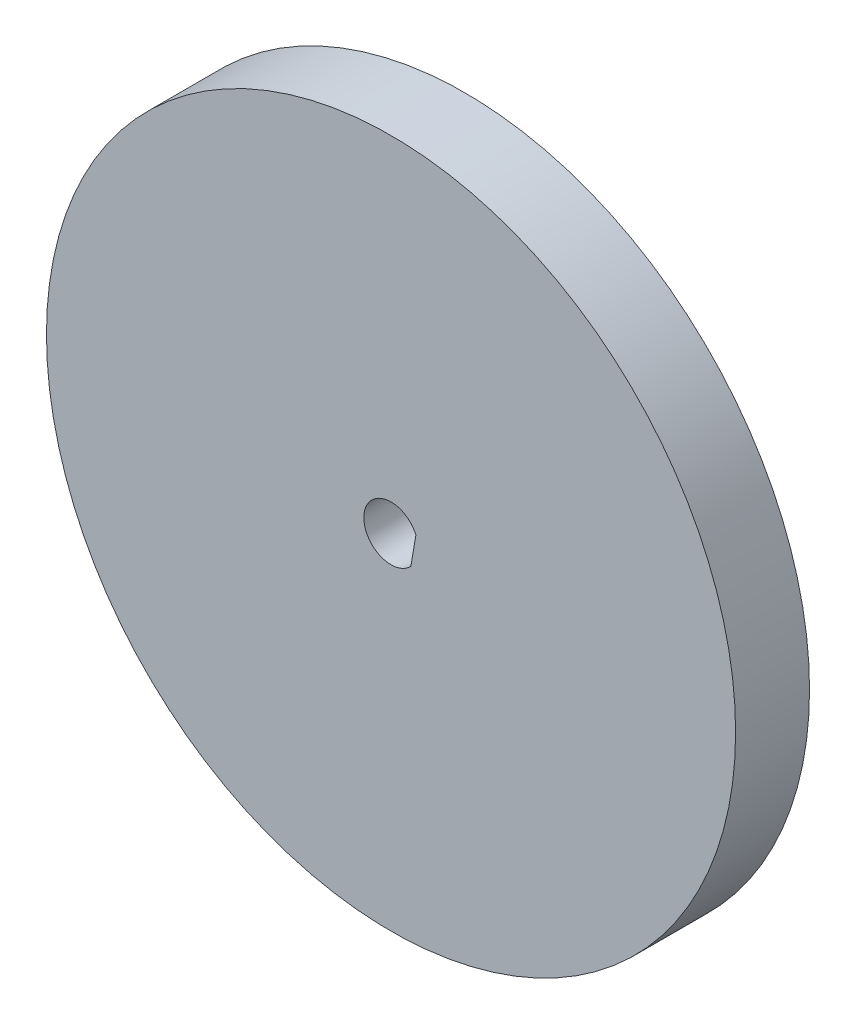
ISO-10303-21;
HEADER;
FILE_DESCRIPTION(('STEP AP214'),'2;1');
FILE_NAME('part.step','',(''),(''),'','','');
FILE_SCHEMA(('AUTOMOTIVE_DESIGN { 1 0 10303 214 1 1 1 1 }'));
ENDSEC;
DATA;
#1=APPLICATION_CONTEXT('core data for automotive mechanical design processes');
#2=APPLICATION_PROTOCOL_DEFINITION('international standard','automotive_design',2000,#1);
#3=PRODUCT_CONTEXT('',#1,'mechanical');
#4=PRODUCT('Part','Part','',(#3));
#5=PRODUCT_RELATED_PRODUCT_CATEGORY('part','',(#4));
#6=PRODUCT_DEFINITION_FORMATION('','',#4);
#7=PRODUCT_DEFINITION_CONTEXT('part definition',#1,'design');
#8=PRODUCT_DEFINITION('design','',#6,#7);
#9=PRODUCT_DEFINITION_SHAPE('','',#8);
#10=(LENGTH_UNIT() NAMED_UNIT(*) SI_UNIT(.MILLI.,.METRE.));
#11=(NAMED_UNIT(*) PLANE_ANGLE_UNIT() SI_UNIT($,.RADIAN.));
#12=(NAMED_UNIT(*) SI_UNIT($,.STERADIAN.) SOLID_ANGLE_UNIT());
#13=UNCERTAINTY_MEASURE_WITH_UNIT(LENGTH_MEASURE(1.E-05),#10,'distance_accuracy_value','');
#14=(GEOMETRIC_REPRESENTATION_CONTEXT(3) GLOBAL_UNCERTAINTY_ASSIGNED_CONTEXT((#13)) GLOBAL_UNIT_ASSIGNED_CONTEXT((#10,
#11,#12)) REPRESENTATION_CONTEXT('',''));
#15=CARTESIAN_POINT('',(0.,0.,0.));
#16=DIRECTION('',(0.,0.,1.));
#17=DIRECTION('',(1.,0.,0.));
#18=AXIS2_PLACEMENT_3D('',#15,#16,#17);
#19=CARTESIAN_POINT('',(-10.991688670515,10.7963621549345,8.1534));
#20=DIRECTION('',(0.,0.,-1.));
#21=DIRECTION('',(-1.,0.,0.));
#22=AXIS2_PLACEMENT_3D('',#19,#20,#21);
#23=CYLINDRICAL_SURFACE('',#22,38.);
#24=CARTESIAN_POINT('',(-10.991688670515,10.7963621549345,8.1534));
#25=DIRECTION('',(0.,0.,1.));
#26=DIRECTION('',(1.,0.,0.));
#27=AXIS2_PLACEMENT_3D('',#24,#25,#26);
#28=CIRCLE('',#27,38.);
#29=CARTESIAN_POINT('',(27.008311329485,10.7963621549345,8.1534));
#30=VERTEX_POINT('',#29);
#31=EDGE_CURVE('E11',#30,#30,#28,.T.);
#32=ORIENTED_EDGE('',*,*,#31,.F.);
#33=EDGE_LOOP('',(#32));
#34=FACE_BOUND('',#33,.T.);
#35=CARTESIAN_POINT('',(-10.991688670515,10.7963621549345,0.));
#36=DIRECTION('',(0.,0.,1.));
#37=DIRECTION('',(1.,0.,0.));
#38=AXIS2_PLACEMENT_3D('',#35,#36,#37);
#39=CIRCLE('',#38,38.);
#40=CARTESIAN_POINT('',(27.008311329485,10.7963621549345,0.));
#41=VERTEX_POINT('',#40);
#42=EDGE_CURVE('E36',#41,#41,#39,.T.);
#43=ORIENTED_EDGE('',*,*,#42,.T.);
#44=EDGE_LOOP('',(#43));
#45=FACE_BOUND('',#44,.T.);
#46=ADVANCED_FACE('F33',(#34,#45),#23,.T.);
#47=CARTESIAN_POINT('',(-10.991688670515,10.7963621549345,8.1534));
#48=DIRECTION('',(0.,0.,1.));
#49=DIRECTION('',(1.,0.,0.));
#50=AXIS2_PLACEMENT_3D('',#47,#48,#49);
#51=PLANE('',#50);
#52=CARTESIAN_POINT('',(-10.991688670515,10.7963621549345,8.1534));
#53=DIRECTION('',(0.,0.,1.));
#54=DIRECTION('',(1.,0.,0.));
#55=AXIS2_PLACEMENT_3D('',#52,#53,#54);
#56=CIRCLE('',#55,3.);
#57=CARTESIAN_POINT('',(-8.24930501310143,12.0126400325393,8.1534));
#58=VERTEX_POINT('',#57);
#59=CARTESIAN_POINT('',(-8.80466798129166,8.74284310099101,8.1534));
#60=VERTEX_POINT('',#59);
#61=EDGE_CURVE('E47',#58,#60,#56,.T.);
#62=ORIENTED_EDGE('',*,*,#61,.F.);
#63=DIRECTION('',(0.167448235267732,0.985880869327386,0.));
#64=VECTOR('',#63,1.);
#65=CARTESIAN_POINT('',(-8.52698649719654,10.3777415667652,8.1534));
#66=LINE('',#65,#64);
#67=EDGE_CURVE('E66',#60,#58,#66,.T.);
#68=ORIENTED_EDGE('',*,*,#67,.F.);
#69=EDGE_LOOP('',(#62,#68));
#70=FACE_BOUND('',#69,.T.);
#71=ORIENTED_EDGE('',*,*,#31,.T.);
#72=EDGE_LOOP('',(#71));
#73=FACE_BOUND('',#72,.T.);
#74=ADVANCED_FACE('F70',(#70,#73),#51,.T.);
#75=CARTESIAN_POINT('',(-10.991688670515,10.7963621549345,0.));
#76=DIRECTION('',(0.,0.,1.));
#77=DIRECTION('',(1.,0.,0.));
#78=AXIS2_PLACEMENT_3D('',#75,#76,#77);
#79=PLANE('',#78);
#80=DIRECTION('',(0.167448235267731,0.985880869327386,0.));
#81=VECTOR('',#80,1.);
#82=CARTESIAN_POINT('',(-8.80466798129165,8.74284310099101,0.));
#83=LINE('',#82,#81);
#84=CARTESIAN_POINT('',(-8.80466798129165,8.74284310099101,0.));
#85=VERTEX_POINT('',#84);
#86=CARTESIAN_POINT('',(-8.24930501310143,12.0126400325393,0.));
#87=VERTEX_POINT('',#86);
#88=EDGE_CURVE('E74',#85,#87,#83,.T.);
#89=ORIENTED_EDGE('',*,*,#88,.T.);
#90=CARTESIAN_POINT('',(-10.991688670515,10.7963621549345,0.));
#91=DIRECTION('',(0.,0.,1.));
#92=DIRECTION('',(1.,0.,0.));
#93=AXIS2_PLACEMENT_3D('',#90,#91,#92);
#94=CIRCLE('',#93,3.);
#95=EDGE_CURVE('E52',#87,#85,#94,.T.);
#96=ORIENTED_EDGE('',*,*,#95,.T.);
#97=EDGE_LOOP('',(#89,#96));
#98=FACE_BOUND('',#97,.T.);
#99=ORIENTED_EDGE('',*,*,#42,.F.);
#100=EDGE_LOOP('',(#99));
#101=FACE_BOUND('',#100,.T.);
#102=ADVANCED_FACE('F78',(#98,#101),#79,.F.);
#103=CARTESIAN_POINT('',(-10.991688670515,10.7963621549345,0.));
#104=DIRECTION('',(0.,0.,1.));
#105=DIRECTION('',(1.,0.,0.));
#106=AXIS2_PLACEMENT_3D('',#103,#104,#105);
#107=CYLINDRICAL_SURFACE('',#106,3.);
#108=ORIENTED_EDGE('',*,*,#61,.T.);
#109=DIRECTION('',(0.,0.,1.));
#110=VECTOR('',#109,1.);
#111=CARTESIAN_POINT('',(-8.80466798129165,8.74284310099101,0.));
#112=LINE('',#111,#110);
#113=EDGE_CURVE('E63',#85,#60,#112,.T.);
#114=ORIENTED_EDGE('',*,*,#113,.F.);
#115=ORIENTED_EDGE('',*,*,#95,.F.);
#116=DIRECTION('',(0.,0.,1.));
#117=VECTOR('',#116,1.);
#118=CARTESIAN_POINT('',(-8.24930501310143,12.0126400325393,0.));
#119=LINE('',#118,#117);
#120=EDGE_CURVE('E57',#87,#58,#119,.T.);
#121=ORIENTED_EDGE('',*,*,#120,.T.);
#122=EDGE_LOOP('',(#108,#114,#115,#121));
#123=FACE_BOUND('',#122,.T.);
#124=ADVANCED_FACE('F59',(#123),#107,.F.);
#125=CARTESIAN_POINT('',(-8.52698649719654,10.3777415667652,0.));
#126=DIRECTION('',(0.985880869327386,-0.167448235267732,0.));
#127=DIRECTION('',(0.167448235267732,0.985880869327386,0.));
#128=AXIS2_PLACEMENT_3D('',#125,#126,#127);
#129=PLANE('',#128);
#130=ORIENTED_EDGE('',*,*,#67,.T.);
#131=ORIENTED_EDGE('',*,*,#120,.F.);
#132=ORIENTED_EDGE('',*,*,#88,.F.);
#133=ORIENTED_EDGE('',*,*,#113,.T.);
#134=EDGE_LOOP('',(#130,#131,#132,#133));
#135=FACE_BOUND('',#134,.T.);
#136=ADVANCED_FACE('F67',(#135),#129,.F.);
#137=CLOSED_SHELL('',(#46,#74,#102,#124,#136));
#138=MANIFOLD_SOLID_BREP('B2',#137);
#139=ADVANCED_BREP_SHAPE_REPRESENTATION('',(#18,#138),#14);
#140=SHAPE_DEFINITION_REPRESENTATION(#9,#139);
ENDSEC;
END-ISO-10303-21;
